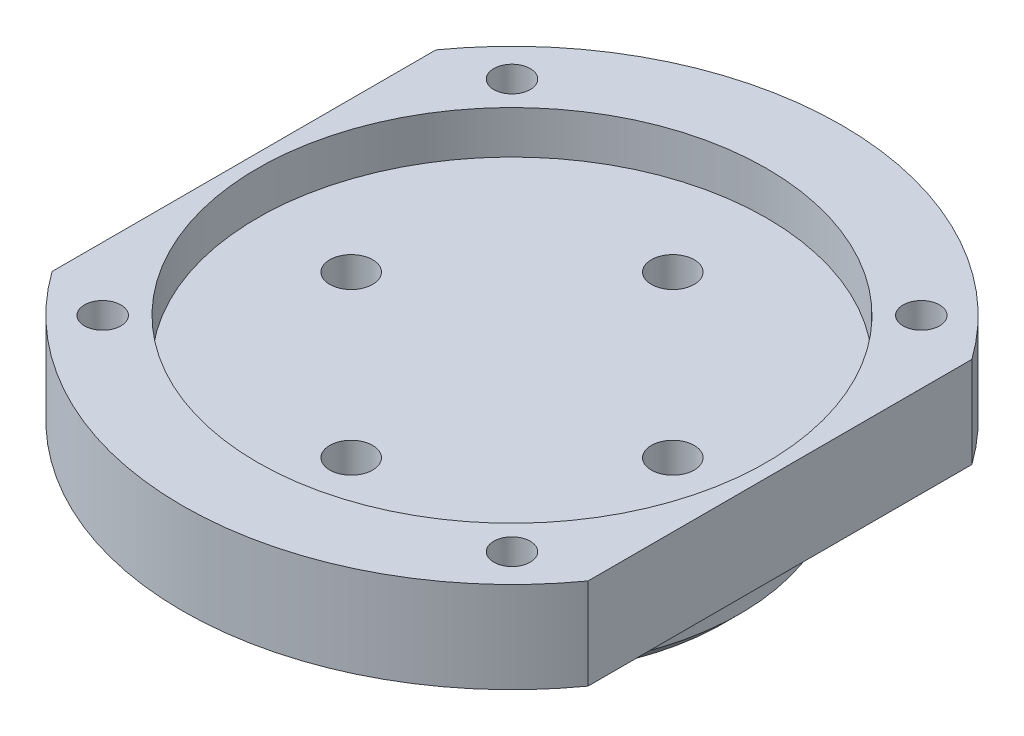
ISO-10303-21;
HEADER;
FILE_DESCRIPTION(('STEP AP214'),'2;1');
FILE_NAME('part.step','',(''),(''),'','','');
FILE_SCHEMA(('AUTOMOTIVE_DESIGN { 1 0 10303 214 1 1 1 1 }'));
ENDSEC;
DATA;
#1=APPLICATION_CONTEXT('core data for automotive mechanical design processes');
#2=APPLICATION_PROTOCOL_DEFINITION('international standard','automotive_design',2000,#1);
#3=PRODUCT_CONTEXT('',#1,'mechanical');
#4=PRODUCT('Part','Part','',(#3));
#5=PRODUCT_RELATED_PRODUCT_CATEGORY('part','',(#4));
#6=PRODUCT_DEFINITION_FORMATION('','',#4);
#7=PRODUCT_DEFINITION_CONTEXT('part definition',#1,'design');
#8=PRODUCT_DEFINITION('design','',#6,#7);
#9=PRODUCT_DEFINITION_SHAPE('','',#8);
#10=(LENGTH_UNIT() NAMED_UNIT(*) SI_UNIT(.MILLI.,.METRE.));
#11=(NAMED_UNIT(*) PLANE_ANGLE_UNIT() SI_UNIT($,.RADIAN.));
#12=(NAMED_UNIT(*) SI_UNIT($,.STERADIAN.) SOLID_ANGLE_UNIT());
#13=UNCERTAINTY_MEASURE_WITH_UNIT(LENGTH_MEASURE(1.E-05),#10,'distance_accuracy_value','');
#14=(GEOMETRIC_REPRESENTATION_CONTEXT(3) GLOBAL_UNCERTAINTY_ASSIGNED_CONTEXT((#13)) GLOBAL_UNIT_ASSIGNED_CONTEXT((#10,
#11,#12)) REPRESENTATION_CONTEXT('',''));
#15=CARTESIAN_POINT('',(0.,0.,0.));
#16=DIRECTION('',(0.,0.,1.));
#17=DIRECTION('',(1.,0.,0.));
#18=AXIS2_PLACEMENT_3D('',#15,#16,#17);
#19=CARTESIAN_POINT('',(0.,30.,30.));
#20=DIRECTION('',(0.,-1.,0.));
#21=DIRECTION('',(0.,0.,-1.));
#22=AXIS2_PLACEMENT_3D('',#19,#20,#21);
#23=CYLINDRICAL_SURFACE('',#22,4.);
#24=CARTESIAN_POINT('',(0.,22.,30.));
#25=DIRECTION('',(0.,1.,0.));
#26=DIRECTION('',(0.,0.,1.));
#27=AXIS2_PLACEMENT_3D('',#24,#25,#26);
#28=CIRCLE('',#27,4.);
#29=CARTESIAN_POINT('',(0.,22.,34.));
#30=VERTEX_POINT('',#29);
#31=EDGE_CURVE('E116',#30,#30,#28,.T.);
#32=ORIENTED_EDGE('',*,*,#31,.T.);
#33=EDGE_LOOP('',(#32));
#34=FACE_BOUND('',#33,.T.);
#35=CARTESIAN_POINT('',(0.,13.,30.));
#36=DIRECTION('',(0.,-1.,0.));
#37=DIRECTION('',(0.,0.,-1.));
#38=AXIS2_PLACEMENT_3D('',#35,#36,#37);
#39=CIRCLE('',#38,4.);
#40=CARTESIAN_POINT('',(0.,13.,26.));
#41=VERTEX_POINT('',#40);
#42=EDGE_CURVE('E120',#41,#41,#39,.F.);
#43=ORIENTED_EDGE('',*,*,#42,.F.);
#44=EDGE_LOOP('',(#43));
#45=FACE_BOUND('',#44,.T.);
#46=ADVANCED_FACE('F41',(#34,#45),#23,.F.);
#47=CARTESIAN_POINT('',(-30.,30.,0.));
#48=DIRECTION('',(0.,-1.,0.));
#49=DIRECTION('',(0.,0.,-1.));
#50=AXIS2_PLACEMENT_3D('',#47,#48,#49);
#51=CYLINDRICAL_SURFACE('',#50,4.00000000000001);
#52=CARTESIAN_POINT('',(-30.,22.,0.));
#53=DIRECTION('',(0.,1.,0.));
#54=DIRECTION('',(0.,0.,1.));
#55=AXIS2_PLACEMENT_3D('',#52,#53,#54);
#56=CIRCLE('',#55,4.00000000000001);
#57=CARTESIAN_POINT('',(-30.,22.,4.));
#58=VERTEX_POINT('',#57);
#59=EDGE_CURVE('E119',#58,#58,#56,.T.);
#60=ORIENTED_EDGE('',*,*,#59,.T.);
#61=EDGE_LOOP('',(#60));
#62=FACE_BOUND('',#61,.T.);
#63=CARTESIAN_POINT('',(-30.,13.,0.));
#64=DIRECTION('',(0.,-1.,0.));
#65=DIRECTION('',(0.,0.,-1.));
#66=AXIS2_PLACEMENT_3D('',#63,#64,#65);
#67=CIRCLE('',#66,4.00000000000001);
#68=CARTESIAN_POINT('',(-30.,13.,-4.00000000000001));
#69=VERTEX_POINT('',#68);
#70=EDGE_CURVE('E136',#69,#69,#67,.F.);
#71=ORIENTED_EDGE('',*,*,#70,.F.);
#72=EDGE_LOOP('',(#71));
#73=FACE_BOUND('',#72,.T.);
#74=ADVANCED_FACE('F226',(#62,#73),#51,.F.);
#75=CARTESIAN_POINT('',(0.,30.,-30.));
#76=DIRECTION('',(0.,-1.,0.));
#77=DIRECTION('',(0.,0.,-1.));
#78=AXIS2_PLACEMENT_3D('',#75,#76,#77);
#79=CYLINDRICAL_SURFACE('',#78,4.00000000000001);
#80=CARTESIAN_POINT('',(0.,22.,-30.));
#81=DIRECTION('',(0.,1.,0.));
#82=DIRECTION('',(0.,0.,1.));
#83=AXIS2_PLACEMENT_3D('',#80,#81,#82);
#84=CIRCLE('',#83,4.00000000000001);
#85=CARTESIAN_POINT('',(0.,22.,-26.));
#86=VERTEX_POINT('',#85);
#87=EDGE_CURVE('E123',#86,#86,#84,.T.);
#88=ORIENTED_EDGE('',*,*,#87,.T.);
#89=EDGE_LOOP('',(#88));
#90=FACE_BOUND('',#89,.T.);
#91=CARTESIAN_POINT('',(0.,13.,-30.));
#92=DIRECTION('',(0.,-1.,0.));
#93=DIRECTION('',(0.,0.,-1.));
#94=AXIS2_PLACEMENT_3D('',#91,#92,#93);
#95=CIRCLE('',#94,4.00000000000001);
#96=CARTESIAN_POINT('',(0.,13.,-34.));
#97=VERTEX_POINT('',#96);
#98=EDGE_CURVE('E132',#97,#97,#95,.F.);
#99=ORIENTED_EDGE('',*,*,#98,.F.);
#100=EDGE_LOOP('',(#99));
#101=FACE_BOUND('',#100,.T.);
#102=ADVANCED_FACE('F232',(#90,#101),#79,.F.);
#103=CARTESIAN_POINT('',(30.,30.,0.));
#104=DIRECTION('',(0.,-1.,0.));
#105=DIRECTION('',(0.,0.,-1.));
#106=AXIS2_PLACEMENT_3D('',#103,#104,#105);
#107=CYLINDRICAL_SURFACE('',#106,4.00000000000001);
#108=CARTESIAN_POINT('',(30.,22.,0.));
#109=DIRECTION('',(0.,1.,0.));
#110=DIRECTION('',(0.,0.,1.));
#111=AXIS2_PLACEMENT_3D('',#108,#109,#110);
#112=CIRCLE('',#111,4.00000000000001);
#113=CARTESIAN_POINT('',(30.,22.,4.00000000000001));
#114=VERTEX_POINT('',#113);
#115=EDGE_CURVE('E126',#114,#114,#112,.T.);
#116=ORIENTED_EDGE('',*,*,#115,.T.);
#117=EDGE_LOOP('',(#116));
#118=FACE_BOUND('',#117,.T.);
#119=CARTESIAN_POINT('',(30.,13.,0.));
#120=DIRECTION('',(0.,-1.,0.));
#121=DIRECTION('',(0.,0.,-1.));
#122=AXIS2_PLACEMENT_3D('',#119,#120,#121);
#123=CIRCLE('',#122,4.00000000000001);
#124=CARTESIAN_POINT('',(30.,13.,-4.00000000000001));
#125=VERTEX_POINT('',#124);
#126=EDGE_CURVE('E129',#125,#125,#123,.F.);
#127=ORIENTED_EDGE('',*,*,#126,.F.);
#128=EDGE_LOOP('',(#127));
#129=FACE_BOUND('',#128,.T.);
#130=ADVANCED_FACE('F282',(#118,#129),#107,.F.);
#131=CARTESIAN_POINT('',(0.,0.,0.));
#132=DIRECTION('',(0.,-1.,0.));
#133=DIRECTION('',(0.,0.,-1.));
#134=AXIS2_PLACEMENT_3D('',#131,#132,#133);
#135=CYLINDRICAL_SURFACE('',#134,61.5);
#136=CARTESIAN_POINT('',(0.,13.,0.));
#137=DIRECTION('',(0.,-1.,0.));
#138=DIRECTION('',(0.,0.,-1.));
#139=AXIS2_PLACEMENT_3D('',#136,#137,#138);
#140=CIRCLE('',#139,61.5);
#141=CARTESIAN_POINT('',(50.,13.,35.8085185395878));
#142=VERTEX_POINT('',#141);
#143=CARTESIAN_POINT('',(-50.,13.,35.8085185395877));
#144=VERTEX_POINT('',#143);
#145=EDGE_CURVE('E100',#142,#144,#140,.T.);
#146=ORIENTED_EDGE('',*,*,#145,.F.);
#147=DIRECTION('',(0.,-1.,0.));
#148=VECTOR('',#147,1.);
#149=CARTESIAN_POINT('',(50.,0.,35.8085185395878));
#150=LINE('',#149,#148);
#151=CARTESIAN_POINT('',(50.,30.,35.8085185395878));
#152=VERTEX_POINT('',#151);
#153=EDGE_CURVE('E85',#152,#142,#150,.T.);
#154=ORIENTED_EDGE('',*,*,#153,.F.);
#155=CARTESIAN_POINT('',(0.,30.,0.));
#156=DIRECTION('',(0.,-1.,0.));
#157=DIRECTION('',(0.,0.,-1.));
#158=AXIS2_PLACEMENT_3D('',#155,#156,#157);
#159=CIRCLE('',#158,61.5);
#160=CARTESIAN_POINT('',(-50.,30.,35.8085185395877));
#161=VERTEX_POINT('',#160);
#162=EDGE_CURVE('E98',#152,#161,#159,.T.);
#163=ORIENTED_EDGE('',*,*,#162,.T.);
#164=DIRECTION('',(0.,-1.,0.));
#165=VECTOR('',#164,1.);
#166=CARTESIAN_POINT('',(-50.,0.,35.8085185395877));
#167=LINE('',#166,#165);
#168=EDGE_CURVE('E59',#144,#161,#167,.F.);
#169=ORIENTED_EDGE('',*,*,#168,.F.);
#170=EDGE_LOOP('',(#146,#154,#163,#169));
#171=FACE_BOUND('',#170,.T.);
#172=ADVANCED_FACE('F97',(#171),#135,.T.);
#173=CARTESIAN_POINT('',(0.,0.,0.));
#174=DIRECTION('',(0.,-1.,0.));
#175=DIRECTION('',(0.,0.,-1.));
#176=AXIS2_PLACEMENT_3D('',#173,#174,#175);
#177=PLANE('',#176);
#178=CARTESIAN_POINT('',(0.,0.,0.));
#179=DIRECTION('',(0.,-1.,0.));
#180=DIRECTION('',(0.,0.,-1.));
#181=AXIS2_PLACEMENT_3D('',#178,#179,#180);
#182=CIRCLE('',#181,39.5);
#183=CARTESIAN_POINT('',(0.,0.,-39.5));
#184=VERTEX_POINT('',#183);
#185=EDGE_CURVE('E51',#184,#184,#182,.T.);
#186=ORIENTED_EDGE('',*,*,#185,.T.);
#187=EDGE_LOOP('',(#186));
#188=FACE_BOUND('',#187,.T.);
#189=CARTESIAN_POINT('',(30.,0.,0.));
#190=DIRECTION('',(0.,-1.,0.));
#191=DIRECTION('',(0.,0.,-1.));
#192=AXIS2_PLACEMENT_3D('',#189,#190,#191);
#193=CIRCLE('',#192,8.);
#194=CARTESIAN_POINT('',(30.,0.,-8.));
#195=VERTEX_POINT('',#194);
#196=EDGE_CURVE('E177',#195,#195,#193,.T.);
#197=ORIENTED_EDGE('',*,*,#196,.F.);
#198=EDGE_LOOP('',(#197));
#199=FACE_BOUND('',#198,.T.);
#200=CARTESIAN_POINT('',(-30.,0.,0.));
#201=DIRECTION('',(0.,-1.,0.));
#202=DIRECTION('',(0.,0.,-1.));
#203=AXIS2_PLACEMENT_3D('',#200,#201,#202);
#204=CIRCLE('',#203,8.);
#205=CARTESIAN_POINT('',(-30.,0.,-8.00000000000001));
#206=VERTEX_POINT('',#205);
#207=EDGE_CURVE('E183',#206,#206,#204,.T.);
#208=ORIENTED_EDGE('',*,*,#207,.F.);
#209=EDGE_LOOP('',(#208));
#210=FACE_BOUND('',#209,.T.);
#211=CARTESIAN_POINT('',(0.,0.,-30.));
#212=DIRECTION('',(0.,-1.,0.));
#213=DIRECTION('',(0.,0.,-1.));
#214=AXIS2_PLACEMENT_3D('',#211,#212,#213);
#215=CIRCLE('',#214,8.);
#216=CARTESIAN_POINT('',(0.,0.,-38.));
#217=VERTEX_POINT('',#216);
#218=EDGE_CURVE('E189',#217,#217,#215,.T.);
#219=ORIENTED_EDGE('',*,*,#218,.F.);
#220=EDGE_LOOP('',(#219));
#221=FACE_BOUND('',#220,.T.);
#222=CARTESIAN_POINT('',(0.,0.,30.));
#223=DIRECTION('',(0.,-1.,0.));
#224=DIRECTION('',(0.,0.,-1.));
#225=AXIS2_PLACEMENT_3D('',#222,#223,#224);
#226=CIRCLE('',#225,8.);
#227=CARTESIAN_POINT('',(0.,0.,22.));
#228=VERTEX_POINT('',#227);
#229=EDGE_CURVE('E146',#228,#228,#226,.T.);
#230=ORIENTED_EDGE('',*,*,#229,.F.);
#231=EDGE_LOOP('',(#230));
#232=FACE_BOUND('',#231,.T.);
#233=ADVANCED_FACE('F314',(#188,#199,#210,#221,#232),#177,.T.);
#234=CARTESIAN_POINT('',(0.,0.,0.));
#235=DIRECTION('',(0.,-1.,0.));
#236=DIRECTION('',(0.,0.,-1.));
#237=AXIS2_PLACEMENT_3D('',#234,#235,#236);
#238=CYLINDRICAL_SURFACE('',#237,42.5);
#239=CARTESIAN_POINT('',(0.,3.00000000000004,0.));
#240=DIRECTION('',(0.,-1.,0.));
#241=DIRECTION('',(0.,0.,-1.));
#242=AXIS2_PLACEMENT_3D('',#239,#240,#241);
#243=CIRCLE('',#242,42.5);
#244=CARTESIAN_POINT('',(0.,3.00000000000004,-42.5));
#245=VERTEX_POINT('',#244);
#246=EDGE_CURVE('E11',#245,#245,#243,.F.);
#247=ORIENTED_EDGE('',*,*,#246,.T.);
#248=EDGE_LOOP('',(#247));
#249=FACE_BOUND('',#248,.T.);
#250=CARTESIAN_POINT('',(0.,13.,0.));
#251=DIRECTION('',(0.,-1.,0.));
#252=DIRECTION('',(0.,0.,-1.));
#253=AXIS2_PLACEMENT_3D('',#250,#251,#252);
#254=CIRCLE('',#253,42.5);
#255=CARTESIAN_POINT('',(0.,13.,-42.5));
#256=VERTEX_POINT('',#255);
#257=EDGE_CURVE('E113',#256,#256,#254,.T.);
#258=ORIENTED_EDGE('',*,*,#257,.T.);
#259=EDGE_LOOP('',(#258));
#260=FACE_BOUND('',#259,.T.);
#261=ADVANCED_FACE('F322',(#249,#260),#238,.T.);
#262=CARTESIAN_POINT('',(42.5,13.,0.));
#263=DIRECTION('',(0.,-1.,0.));
#264=DIRECTION('',(0.,0.,-1.));
#265=AXIS2_PLACEMENT_3D('',#262,#263,#264);
#266=PLANE('',#265);
#267=CARTESIAN_POINT('',(38.1837661840736,13.,-38.1837661840736));
#268=DIRECTION('',(0.,-1.,0.));
#269=DIRECTION('',(0.,0.,-1.));
#270=AXIS2_PLACEMENT_3D('',#267,#268,#269);
#271=CIRCLE('',#270,4.025);
#272=CARTESIAN_POINT('',(38.1837661840736,13.,-42.2087661840736));
#273=VERTEX_POINT('',#272);
#274=EDGE_CURVE('E579',#273,#273,#271,.T.);
#275=ORIENTED_EDGE('',*,*,#274,.F.);
#276=EDGE_LOOP('',(#275));
#277=FACE_BOUND('',#276,.T.);
#278=CARTESIAN_POINT('',(-38.1837661840736,13.,-38.1837661840736));
#279=DIRECTION('',(0.,-1.,0.));
#280=DIRECTION('',(0.,0.,-1.));
#281=AXIS2_PLACEMENT_3D('',#278,#279,#280);
#282=CIRCLE('',#281,4.025);
#283=CARTESIAN_POINT('',(-38.1837661840736,13.,-42.2087661840736));
#284=VERTEX_POINT('',#283);
#285=EDGE_CURVE('E161',#284,#284,#282,.T.);
#286=ORIENTED_EDGE('',*,*,#285,.F.);
#287=EDGE_LOOP('',(#286));
#288=FACE_BOUND('',#287,.T.);
#289=CARTESIAN_POINT('',(-38.1837661840735,13.,38.1837661840736));
#290=DIRECTION('',(0.,-1.,0.));
#291=DIRECTION('',(0.,0.,-1.));
#292=AXIS2_PLACEMENT_3D('',#289,#290,#291);
#293=CIRCLE('',#292,4.025);
#294=CARTESIAN_POINT('',(-38.1837661840735,13.,34.1587661840736));
#295=VERTEX_POINT('',#294);
#296=EDGE_CURVE('E154',#295,#295,#293,.T.);
#297=ORIENTED_EDGE('',*,*,#296,.F.);
#298=EDGE_LOOP('',(#297));
#299=FACE_BOUND('',#298,.T.);
#300=CARTESIAN_POINT('',(38.1837661840736,13.,38.1837661840735));
#301=DIRECTION('',(0.,-1.,0.));
#302=DIRECTION('',(0.,0.,-1.));
#303=AXIS2_PLACEMENT_3D('',#300,#301,#302);
#304=CIRCLE('',#303,4.025);
#305=CARTESIAN_POINT('',(38.1837661840736,13.,34.1587661840735));
#306=VERTEX_POINT('',#305);
#307=EDGE_CURVE('E150',#306,#306,#304,.T.);
#308=ORIENTED_EDGE('',*,*,#307,.F.);
#309=EDGE_LOOP('',(#308));
#310=FACE_BOUND('',#309,.T.);
#311=CARTESIAN_POINT('',(-50.,13.,-35.8085185395877));
#312=VERTEX_POINT('',#311);
#313=CARTESIAN_POINT('',(50.,13.,-35.8085185395878));
#314=VERTEX_POINT('',#313);
#315=EDGE_CURVE('E104',#312,#314,#140,.T.);
#316=ORIENTED_EDGE('',*,*,#315,.T.);
#317=DIRECTION('',(0.,0.,-1.));
#318=VECTOR('',#317,1.);
#319=CARTESIAN_POINT('',(50.,13.,61.5));
#320=LINE('',#319,#318);
#321=EDGE_CURVE('E92',#142,#314,#320,.T.);
#322=ORIENTED_EDGE('',*,*,#321,.F.);
#323=ORIENTED_EDGE('',*,*,#145,.T.);
#324=DIRECTION('',(0.,0.,1.));
#325=VECTOR('',#324,1.);
#326=CARTESIAN_POINT('',(-50.,13.,61.5));
#327=LINE('',#326,#325);
#328=EDGE_CURVE('E101',#312,#144,#327,.T.);
#329=ORIENTED_EDGE('',*,*,#328,.F.);
#330=EDGE_LOOP('',(#316,#322,#323,#329));
#331=FACE_BOUND('',#330,.T.);
#332=ORIENTED_EDGE('',*,*,#257,.F.);
#333=EDGE_LOOP('',(#332));
#334=FACE_BOUND('',#333,.T.);
#335=ADVANCED_FACE('F330',(#277,#288,#299,#310,#331,#334),#266,.T.);
#336=CARTESIAN_POINT('',(-50.,30.,-35.8085185395877));
#337=VERTEX_POINT('',#336);
#338=CARTESIAN_POINT('',(50.,30.,-35.8085185395878));
#339=VERTEX_POINT('',#338);
#340=EDGE_CURVE('E105',#337,#339,#159,.T.);
#341=ORIENTED_EDGE('',*,*,#340,.T.);
#342=DIRECTION('',(0.,-1.,0.));
#343=VECTOR('',#342,1.);
#344=CARTESIAN_POINT('',(50.,0.,-35.8085185395878));
#345=LINE('',#344,#343);
#346=EDGE_CURVE('E67',#314,#339,#345,.F.);
#347=ORIENTED_EDGE('',*,*,#346,.F.);
#348=ORIENTED_EDGE('',*,*,#315,.F.);
#349=DIRECTION('',(0.,-1.,0.));
#350=VECTOR('',#349,1.);
#351=CARTESIAN_POINT('',(-50.,0.,-35.8085185395877));
#352=LINE('',#351,#350);
#353=EDGE_CURVE('E198',#337,#312,#352,.T.);
#354=ORIENTED_EDGE('',*,*,#353,.F.);
#355=EDGE_LOOP('',(#341,#347,#348,#354));
#356=FACE_BOUND('',#355,.T.);
#357=ADVANCED_FACE('F222',(#356),#135,.T.);
#358=CARTESIAN_POINT('',(61.5,30.,0.));
#359=DIRECTION('',(0.,1.,0.));
#360=DIRECTION('',(0.,0.,1.));
#361=AXIS2_PLACEMENT_3D('',#358,#359,#360);
#362=PLANE('',#361);
#363=CARTESIAN_POINT('',(38.1837661840736,30.,-38.1837661840736));
#364=DIRECTION('',(0.,1.,0.));
#365=DIRECTION('',(0.,0.,1.));
#366=AXIS2_PLACEMENT_3D('',#363,#364,#365);
#367=CIRCLE('',#366,3.39999999999999);
#368=CARTESIAN_POINT('',(38.1837661840736,30.,-34.7837661840736));
#369=VERTEX_POINT('',#368);
#370=EDGE_CURVE('E46',#369,#369,#367,.T.);
#371=ORIENTED_EDGE('',*,*,#370,.F.);
#372=EDGE_LOOP('',(#371));
#373=FACE_BOUND('',#372,.T.);
#374=CARTESIAN_POINT('',(-38.1837661840736,30.,-38.1837661840736));
#375=DIRECTION('',(0.,1.,0.));
#376=DIRECTION('',(0.,0.,1.));
#377=AXIS2_PLACEMENT_3D('',#374,#375,#376);
#378=CIRCLE('',#377,3.39999999999999);
#379=CARTESIAN_POINT('',(-38.1837661840736,30.,-34.7837661840736));
#380=VERTEX_POINT('',#379);
#381=EDGE_CURVE('E152',#380,#380,#378,.T.);
#382=ORIENTED_EDGE('',*,*,#381,.F.);
#383=EDGE_LOOP('',(#382));
#384=FACE_BOUND('',#383,.T.);
#385=CARTESIAN_POINT('',(-38.1837661840735,30.,38.1837661840736));
#386=DIRECTION('',(0.,1.,0.));
#387=DIRECTION('',(0.,0.,1.));
#388=AXIS2_PLACEMENT_3D('',#385,#386,#387);
#389=CIRCLE('',#388,3.39999999999999);
#390=CARTESIAN_POINT('',(-38.1837661840735,30.,41.5837661840736));
#391=VERTEX_POINT('',#390);
#392=EDGE_CURVE('E148',#391,#391,#389,.T.);
#393=ORIENTED_EDGE('',*,*,#392,.F.);
#394=EDGE_LOOP('',(#393));
#395=FACE_BOUND('',#394,.T.);
#396=CARTESIAN_POINT('',(38.1837661840736,30.,38.1837661840735));
#397=DIRECTION('',(0.,1.,0.));
#398=DIRECTION('',(0.,0.,1.));
#399=AXIS2_PLACEMENT_3D('',#396,#397,#398);
#400=CIRCLE('',#399,3.39999999999999);
#401=CARTESIAN_POINT('',(38.1837661840736,30.,41.5837661840735));
#402=VERTEX_POINT('',#401);
#403=EDGE_CURVE('E143',#402,#402,#400,.T.);
#404=ORIENTED_EDGE('',*,*,#403,.F.);
#405=EDGE_LOOP('',(#404));
#406=FACE_BOUND('',#405,.T.);
#407=CARTESIAN_POINT('',(0.,30.,0.));
#408=DIRECTION('',(0.,-1.,0.));
#409=DIRECTION('',(0.,0.,-1.));
#410=AXIS2_PLACEMENT_3D('',#407,#408,#409);
#411=CIRCLE('',#410,47.5);
#412=CARTESIAN_POINT('',(0.,30.,-47.5));
#413=VERTEX_POINT('',#412);
#414=EDGE_CURVE('E109',#413,#413,#411,.T.);
#415=ORIENTED_EDGE('',*,*,#414,.T.);
#416=EDGE_LOOP('',(#415));
#417=FACE_BOUND('',#416,.T.);
#418=ORIENTED_EDGE('',*,*,#162,.F.);
#419=DIRECTION('',(0.,0.,-1.));
#420=VECTOR('',#419,1.);
#421=CARTESIAN_POINT('',(50.,30.,61.5));
#422=LINE('',#421,#420);
#423=EDGE_CURVE('E82',#152,#339,#422,.T.);
#424=ORIENTED_EDGE('',*,*,#423,.T.);
#425=ORIENTED_EDGE('',*,*,#340,.F.);
#426=DIRECTION('',(0.,0.,1.));
#427=VECTOR('',#426,1.);
#428=CARTESIAN_POINT('',(-50.,30.,61.5));
#429=LINE('',#428,#427);
#430=EDGE_CURVE('E91',#337,#161,#429,.T.);
#431=ORIENTED_EDGE('',*,*,#430,.T.);
#432=EDGE_LOOP('',(#418,#424,#425,#431));
#433=FACE_BOUND('',#432,.T.);
#434=ADVANCED_FACE('F103',(#373,#384,#395,#406,#417,#433),#362,.T.);
#435=CARTESIAN_POINT('',(0.,0.,0.));
#436=DIRECTION('',(0.,-1.,0.));
#437=DIRECTION('',(0.,0.,-1.));
#438=AXIS2_PLACEMENT_3D('',#435,#436,#437);
#439=CYLINDRICAL_SURFACE('',#438,47.5);
#440=CARTESIAN_POINT('',(0.,22.,0.));
#441=DIRECTION('',(0.,-1.,0.));
#442=DIRECTION('',(0.,0.,-1.));
#443=AXIS2_PLACEMENT_3D('',#440,#441,#442);
#444=CIRCLE('',#443,47.5);
#445=CARTESIAN_POINT('',(0.,22.,-47.5));
#446=VERTEX_POINT('',#445);
#447=EDGE_CURVE('E203',#446,#446,#444,.T.);
#448=ORIENTED_EDGE('',*,*,#447,.T.);
#449=EDGE_LOOP('',(#448));
#450=FACE_BOUND('',#449,.T.);
#451=ORIENTED_EDGE('',*,*,#414,.F.);
#452=EDGE_LOOP('',(#451));
#453=FACE_BOUND('',#452,.T.);
#454=ADVANCED_FACE('F211',(#450,#453),#439,.F.);
#455=CARTESIAN_POINT('',(47.5,22.,0.));
#456=DIRECTION('',(0.,1.,0.));
#457=DIRECTION('',(0.,0.,1.));
#458=AXIS2_PLACEMENT_3D('',#455,#456,#457);
#459=PLANE('',#458);
#460=ORIENTED_EDGE('',*,*,#115,.F.);
#461=EDGE_LOOP('',(#460));
#462=FACE_BOUND('',#461,.T.);
#463=ORIENTED_EDGE('',*,*,#87,.F.);
#464=EDGE_LOOP('',(#463));
#465=FACE_BOUND('',#464,.T.);
#466=ORIENTED_EDGE('',*,*,#59,.F.);
#467=EDGE_LOOP('',(#466));
#468=FACE_BOUND('',#467,.T.);
#469=ORIENTED_EDGE('',*,*,#31,.F.);
#470=EDGE_LOOP('',(#469));
#471=FACE_BOUND('',#470,.T.);
#472=ORIENTED_EDGE('',*,*,#447,.F.);
#473=EDGE_LOOP('',(#472));
#474=FACE_BOUND('',#473,.T.);
#475=ADVANCED_FACE('F213',(#462,#465,#468,#471,#474),#459,.T.);
#476=CARTESIAN_POINT('',(-50.,-0.001000000000001,61.5));
#477=DIRECTION('',(-1.,0.,0.));
#478=DIRECTION('',(0.,0.,1.));
#479=AXIS2_PLACEMENT_3D('',#476,#477,#478);
#480=PLANE('',#479);
#481=ORIENTED_EDGE('',*,*,#430,.F.);
#482=ORIENTED_EDGE('',*,*,#353,.T.);
#483=ORIENTED_EDGE('',*,*,#328,.T.);
#484=ORIENTED_EDGE('',*,*,#168,.T.);
#485=EDGE_LOOP('',(#481,#482,#483,#484));
#486=FACE_BOUND('',#485,.T.);
#487=ADVANCED_FACE('F219',(#486),#480,.T.);
#488=CARTESIAN_POINT('',(50.,-0.001000000000001,61.5));
#489=DIRECTION('',(1.,0.,0.));
#490=DIRECTION('',(0.,0.,-1.));
#491=AXIS2_PLACEMENT_3D('',#488,#489,#490);
#492=PLANE('',#491);
#493=ORIENTED_EDGE('',*,*,#423,.F.);
#494=ORIENTED_EDGE('',*,*,#153,.T.);
#495=ORIENTED_EDGE('',*,*,#321,.T.);
#496=ORIENTED_EDGE('',*,*,#346,.T.);
#497=EDGE_LOOP('',(#493,#494,#495,#496));
#498=FACE_BOUND('',#497,.T.);
#499=ADVANCED_FACE('F84',(#498),#492,.T.);
#500=CARTESIAN_POINT('',(30.,13.,0.));
#501=DIRECTION('',(0.,-1.,0.));
#502=DIRECTION('',(0.,0.,-1.));
#503=AXIS2_PLACEMENT_3D('',#500,#501,#502);
#504=PLANE('',#503);
#505=CARTESIAN_POINT('',(30.,13.,0.));
#506=DIRECTION('',(0.,-1.,0.));
#507=DIRECTION('',(0.,0.,-1.));
#508=AXIS2_PLACEMENT_3D('',#505,#506,#507);
#509=CIRCLE('',#508,8.);
#510=CARTESIAN_POINT('',(30.,13.,-8.));
#511=VERTEX_POINT('',#510);
#512=EDGE_CURVE('E133',#511,#511,#509,.T.);
#513=ORIENTED_EDGE('',*,*,#512,.T.);
#514=EDGE_LOOP('',(#513));
#515=FACE_BOUND('',#514,.T.);
#516=ORIENTED_EDGE('',*,*,#126,.T.);
#517=EDGE_LOOP('',(#516));
#518=FACE_BOUND('',#517,.T.);
#519=ADVANCED_FACE('F241',(#515,#518),#504,.T.);
#520=CARTESIAN_POINT('',(30.,13.,0.));
#521=DIRECTION('',(0.,-1.,0.));
#522=DIRECTION('',(0.,0.,-1.));
#523=AXIS2_PLACEMENT_3D('',#520,#521,#522);
#524=CYLINDRICAL_SURFACE('',#523,8.);
#525=CARTESIAN_POINT('',(30.,13.,-8.));
#526=CARTESIAN_POINT('',(30.,12.8645833333333,-8.));
#527=CARTESIAN_POINT('',(30.,12.7291666666667,-8.));
#528=CARTESIAN_POINT('',(30.,12.4583333333333,-8.));
#529=CARTESIAN_POINT('',(30.,12.3229166666667,-8.));
#530=CARTESIAN_POINT('',(30.,12.0520833333333,-8.));
#531=CARTESIAN_POINT('',(30.,11.9166666666667,-8.));
#532=CARTESIAN_POINT('',(30.,11.6458333333333,-8.));
#533=CARTESIAN_POINT('',(30.,11.5104166666667,-8.));
#534=CARTESIAN_POINT('',(30.,11.2395833333333,-8.));
#535=CARTESIAN_POINT('',(30.,11.1041666666667,-8.));
#536=CARTESIAN_POINT('',(30.,10.8333333333333,-8.));
#537=CARTESIAN_POINT('',(30.,10.6979166666667,-8.));
#538=CARTESIAN_POINT('',(30.,10.4270833333333,-8.));
#539=CARTESIAN_POINT('',(30.,10.2916666666667,-8.));
#540=CARTESIAN_POINT('',(30.,10.0208333333333,-8.));
#541=CARTESIAN_POINT('',(30.,9.88541666666667,-8.));
#542=CARTESIAN_POINT('',(30.,9.61458333333333,-8.));
#543=CARTESIAN_POINT('',(30.,9.47916666666667,-8.));
#544=CARTESIAN_POINT('',(30.,9.20833333333333,-8.));
#545=CARTESIAN_POINT('',(30.,9.07291666666667,-8.));
#546=CARTESIAN_POINT('',(30.,8.80208333333333,-8.));
#547=CARTESIAN_POINT('',(30.,8.66666666666667,-8.));
#548=CARTESIAN_POINT('',(30.,8.39583333333333,-8.));
#549=CARTESIAN_POINT('',(30.,8.26041666666667,-8.));
#550=CARTESIAN_POINT('',(30.,7.98958333333333,-8.));
#551=CARTESIAN_POINT('',(30.,7.85416666666667,-8.));
#552=CARTESIAN_POINT('',(30.,7.58333333333333,-8.));
#553=CARTESIAN_POINT('',(30.,7.44791666666667,-8.));
#554=CARTESIAN_POINT('',(30.,7.17708333333333,-8.));
#555=CARTESIAN_POINT('',(30.,7.04166666666667,-8.));
#556=CARTESIAN_POINT('',(30.,6.77083333333333,-8.));
#557=CARTESIAN_POINT('',(30.,6.63541666666667,-8.));
#558=CARTESIAN_POINT('',(30.,6.36458333333333,-8.));
#559=CARTESIAN_POINT('',(30.,6.22916666666667,-8.));
#560=CARTESIAN_POINT('',(30.,5.95833333333333,-8.));
#561=CARTESIAN_POINT('',(30.,5.82291666666667,-8.));
#562=CARTESIAN_POINT('',(30.,5.55208333333333,-8.));
#563=CARTESIAN_POINT('',(30.,5.41666666666667,-8.));
#564=CARTESIAN_POINT('',(30.,5.14583333333333,-8.));
#565=CARTESIAN_POINT('',(30.,5.01041666666667,-8.));
#566=CARTESIAN_POINT('',(30.,4.73958333333333,-8.));
#567=CARTESIAN_POINT('',(30.,4.60416666666667,-8.));
#568=CARTESIAN_POINT('',(30.,4.33333333333333,-8.));
#569=CARTESIAN_POINT('',(30.,4.19791666666667,-8.));
#570=CARTESIAN_POINT('',(30.,3.92708333333333,-8.));
#571=CARTESIAN_POINT('',(30.,3.79166666666667,-8.));
#572=CARTESIAN_POINT('',(30.,3.52083333333333,-8.));
#573=CARTESIAN_POINT('',(30.,3.38541666666667,-8.));
#574=CARTESIAN_POINT('',(30.,3.11458333333333,-8.));
#575=CARTESIAN_POINT('',(30.,2.97916666666667,-8.));
#576=CARTESIAN_POINT('',(30.,2.70833333333333,-8.));
#577=CARTESIAN_POINT('',(30.,2.57291666666667,-8.));
#578=CARTESIAN_POINT('',(30.,2.30208333333333,-8.));
#579=CARTESIAN_POINT('',(30.,2.16666666666667,-8.));
#580=CARTESIAN_POINT('',(30.,1.89583333333333,-8.));
#581=CARTESIAN_POINT('',(30.,1.76041666666667,-8.));
#582=CARTESIAN_POINT('',(30.,1.48958333333333,-8.));
#583=CARTESIAN_POINT('',(30.,1.35416666666667,-8.));
#584=CARTESIAN_POINT('',(30.,1.08333333333333,-8.));
#585=CARTESIAN_POINT('',(30.,0.947916666666667,-8.));
#586=CARTESIAN_POINT('',(30.,0.677083333333334,-8.));
#587=CARTESIAN_POINT('',(30.,0.541666666666667,-8.));
#588=CARTESIAN_POINT('',(30.,0.270833333333334,-8.));
#589=CARTESIAN_POINT('',(30.,0.135416666666667,-8.));
#590=CARTESIAN_POINT('',(30.,0.,-8.));
#591=B_SPLINE_CURVE_WITH_KNOTS('',3,(#525,#526,#527,#528,#529,#530,#531,#532,#533,#534,#535,
#536,#537,#538,#539,#540,#541,#542,#543,#544,#545,#546,#547,#548,#549,#550,#551,#552,#553,#554,
#555,#556,#557,#558,#559,#560,#561,#562,#563,#564,#565,#566,#567,#568,#569,#570,#571,#572,#573,
#574,#575,#576,#577,#578,#579,#580,#581,#582,#583,#584,#585,#586,#587,#588,#589,#590),
.UNSPECIFIED.,.F.,.F.,(4,2,2,2,2,2,2,2,2,2,2,2,2,2,2,2,2,2,2,2,2,2,2,2,2,2,2,2,2,2,2,2,4),(0.,
0.406249999999999,0.812499999999999,1.21875,1.625,2.03125,2.4375,2.84375,3.25,3.65625,4.0625,
4.46875,4.875,5.28125,5.6875,6.09375,6.5,6.90625,7.3125,7.71875,8.125,8.53125,8.9375,9.34375,
9.75,10.15625,10.5625,10.96875,11.375,11.78125,12.1875,12.59375,13.),.UNSPECIFIED.);
#592=EDGE_CURVE('BSEAM245',#511,#195,#591,.T.);
#593=ORIENTED_EDGE('',*,*,#512,.F.);
#594=ORIENTED_EDGE('',*,*,#196,.T.);
#595=ORIENTED_EDGE('',*,*,#592,.T.);
#596=ORIENTED_EDGE('',*,*,#592,.F.);
#597=EDGE_LOOP('',(#593,#595,#594,#596));
#598=FACE_BOUND('',#597,.T.);
#599=ADVANCED_FACE('F245',(#598),#524,.F.);
#600=CARTESIAN_POINT('',(0.,13.,-30.));
#601=DIRECTION('',(0.,-1.,0.));
#602=DIRECTION('',(0.,0.,-1.));
#603=AXIS2_PLACEMENT_3D('',#600,#601,#602);
#604=PLANE('',#603);
#605=CARTESIAN_POINT('',(0.,13.,-30.));
#606=DIRECTION('',(0.,-1.,0.));
#607=DIRECTION('',(0.,0.,-1.));
#608=AXIS2_PLACEMENT_3D('',#605,#606,#607);
#609=CIRCLE('',#608,8.);
#610=CARTESIAN_POINT('',(0.,13.,-38.));
#611=VERTEX_POINT('',#610);
#612=EDGE_CURVE('E186',#611,#611,#609,.T.);
#613=ORIENTED_EDGE('',*,*,#612,.T.);
#614=EDGE_LOOP('',(#613));
#615=FACE_BOUND('',#614,.T.);
#616=ORIENTED_EDGE('',*,*,#98,.T.);
#617=EDGE_LOOP('',(#616));
#618=FACE_BOUND('',#617,.T.);
#619=ADVANCED_FACE('F251',(#615,#618),#604,.T.);
#620=CARTESIAN_POINT('',(0.,13.,-30.));
#621=DIRECTION('',(0.,-1.,0.));
#622=DIRECTION('',(0.,0.,-1.));
#623=AXIS2_PLACEMENT_3D('',#620,#621,#622);
#624=CYLINDRICAL_SURFACE('',#623,8.);
#625=CARTESIAN_POINT('',(0.,13.,-38.));
#626=CARTESIAN_POINT('',(0.,12.8645833333333,-38.));
#627=CARTESIAN_POINT('',(0.,12.7291666666667,-38.));
#628=CARTESIAN_POINT('',(0.,12.4583333333333,-38.));
#629=CARTESIAN_POINT('',(0.,12.3229166666667,-38.));
#630=CARTESIAN_POINT('',(0.,12.0520833333333,-38.));
#631=CARTESIAN_POINT('',(0.,11.9166666666667,-38.));
#632=CARTESIAN_POINT('',(0.,11.6458333333333,-38.));
#633=CARTESIAN_POINT('',(0.,11.5104166666667,-38.));
#634=CARTESIAN_POINT('',(0.,11.2395833333333,-38.));
#635=CARTESIAN_POINT('',(0.,11.1041666666667,-38.));
#636=CARTESIAN_POINT('',(0.,10.8333333333333,-38.));
#637=CARTESIAN_POINT('',(0.,10.6979166666667,-38.));
#638=CARTESIAN_POINT('',(0.,10.4270833333333,-38.));
#639=CARTESIAN_POINT('',(0.,10.2916666666667,-38.));
#640=CARTESIAN_POINT('',(0.,10.0208333333333,-38.));
#641=CARTESIAN_POINT('',(0.,9.88541666666667,-38.));
#642=CARTESIAN_POINT('',(0.,9.61458333333333,-38.));
#643=CARTESIAN_POINT('',(0.,9.47916666666667,-38.));
#644=CARTESIAN_POINT('',(0.,9.20833333333333,-38.));
#645=CARTESIAN_POINT('',(0.,9.07291666666667,-38.));
#646=CARTESIAN_POINT('',(0.,8.80208333333333,-38.));
#647=CARTESIAN_POINT('',(0.,8.66666666666667,-38.));
#648=CARTESIAN_POINT('',(0.,8.39583333333333,-38.));
#649=CARTESIAN_POINT('',(0.,8.26041666666667,-38.));
#650=CARTESIAN_POINT('',(0.,7.98958333333333,-38.));
#651=CARTESIAN_POINT('',(0.,7.85416666666667,-38.));
#652=CARTESIAN_POINT('',(0.,7.58333333333333,-38.));
#653=CARTESIAN_POINT('',(0.,7.44791666666667,-38.));
#654=CARTESIAN_POINT('',(0.,7.17708333333333,-38.));
#655=CARTESIAN_POINT('',(0.,7.04166666666667,-38.));
#656=CARTESIAN_POINT('',(0.,6.77083333333333,-38.));
#657=CARTESIAN_POINT('',(0.,6.63541666666667,-38.));
#658=CARTESIAN_POINT('',(0.,6.36458333333333,-38.));
#659=CARTESIAN_POINT('',(0.,6.22916666666667,-38.));
#660=CARTESIAN_POINT('',(0.,5.95833333333333,-38.));
#661=CARTESIAN_POINT('',(0.,5.82291666666667,-38.));
#662=CARTESIAN_POINT('',(0.,5.55208333333333,-38.));
#663=CARTESIAN_POINT('',(0.,5.41666666666667,-38.));
#664=CARTESIAN_POINT('',(0.,5.14583333333333,-38.));
#665=CARTESIAN_POINT('',(0.,5.01041666666667,-38.));
#666=CARTESIAN_POINT('',(0.,4.73958333333333,-38.));
#667=CARTESIAN_POINT('',(0.,4.60416666666667,-38.));
#668=CARTESIAN_POINT('',(0.,4.33333333333333,-38.));
#669=CARTESIAN_POINT('',(0.,4.19791666666667,-38.));
#670=CARTESIAN_POINT('',(0.,3.92708333333333,-38.));
#671=CARTESIAN_POINT('',(0.,3.79166666666667,-38.));
#672=CARTESIAN_POINT('',(0.,3.52083333333333,-38.));
#673=CARTESIAN_POINT('',(0.,3.38541666666667,-38.));
#674=CARTESIAN_POINT('',(0.,3.11458333333333,-38.));
#675=CARTESIAN_POINT('',(0.,2.97916666666667,-38.));
#676=CARTESIAN_POINT('',(0.,2.70833333333333,-38.));
#677=CARTESIAN_POINT('',(0.,2.57291666666667,-38.));
#678=CARTESIAN_POINT('',(0.,2.30208333333333,-38.));
#679=CARTESIAN_POINT('',(0.,2.16666666666667,-38.));
#680=CARTESIAN_POINT('',(0.,1.89583333333333,-38.));
#681=CARTESIAN_POINT('',(0.,1.76041666666667,-38.));
#682=CARTESIAN_POINT('',(0.,1.48958333333333,-38.));
#683=CARTESIAN_POINT('',(0.,1.35416666666667,-38.));
#684=CARTESIAN_POINT('',(0.,1.08333333333333,-38.));
#685=CARTESIAN_POINT('',(0.,0.947916666666667,-38.));
#686=CARTESIAN_POINT('',(0.,0.677083333333334,-38.));
#687=CARTESIAN_POINT('',(0.,0.541666666666667,-38.));
#688=CARTESIAN_POINT('',(0.,0.270833333333334,-38.));
#689=CARTESIAN_POINT('',(0.,0.135416666666667,-38.));
#690=CARTESIAN_POINT('',(0.,0.,-38.));
#691=B_SPLINE_CURVE_WITH_KNOTS('',3,(#625,#626,#627,#628,#629,#630,#631,#632,#633,#634,#635,
#636,#637,#638,#639,#640,#641,#642,#643,#644,#645,#646,#647,#648,#649,#650,#651,#652,#653,#654,
#655,#656,#657,#658,#659,#660,#661,#662,#663,#664,#665,#666,#667,#668,#669,#670,#671,#672,#673,
#674,#675,#676,#677,#678,#679,#680,#681,#682,#683,#684,#685,#686,#687,#688,#689,#690),
.UNSPECIFIED.,.F.,.F.,(4,2,2,2,2,2,2,2,2,2,2,2,2,2,2,2,2,2,2,2,2,2,2,2,2,2,2,2,2,2,2,2,4),(0.,
0.406249999999999,0.812499999999999,1.21875,1.625,2.03125,2.4375,2.84375,3.25,3.65625,4.0625,
4.46875,4.875,5.28125,5.6875,6.09375,6.5,6.90625,7.3125,7.71875,8.125,8.53125,8.9375,9.34375,
9.75,10.15625,10.5625,10.96875,11.375,11.78125,12.1875,12.59375,13.),.UNSPECIFIED.);
#692=EDGE_CURVE('BSEAM263',#611,#217,#691,.T.);
#693=ORIENTED_EDGE('',*,*,#612,.F.);
#694=ORIENTED_EDGE('',*,*,#218,.T.);
#695=ORIENTED_EDGE('',*,*,#692,.T.);
#696=ORIENTED_EDGE('',*,*,#692,.F.);
#697=EDGE_LOOP('',(#693,#695,#694,#696));
#698=FACE_BOUND('',#697,.T.);
#699=ADVANCED_FACE('F263',(#698),#624,.F.);
#700=CARTESIAN_POINT('',(-30.,13.,0.));
#701=DIRECTION('',(0.,-1.,0.));
#702=DIRECTION('',(0.,0.,-1.));
#703=AXIS2_PLACEMENT_3D('',#700,#701,#702);
#704=PLANE('',#703);
#705=CARTESIAN_POINT('',(-30.,13.,0.));
#706=DIRECTION('',(0.,-1.,0.));
#707=DIRECTION('',(0.,0.,-1.));
#708=AXIS2_PLACEMENT_3D('',#705,#706,#707);
#709=CIRCLE('',#708,8.);
#710=CARTESIAN_POINT('',(-30.,13.,-8.00000000000001));
#711=VERTEX_POINT('',#710);
#712=EDGE_CURVE('E180',#711,#711,#709,.T.);
#713=ORIENTED_EDGE('',*,*,#712,.T.);
#714=EDGE_LOOP('',(#713));
#715=FACE_BOUND('',#714,.T.);
#716=ORIENTED_EDGE('',*,*,#70,.T.);
#717=EDGE_LOOP('',(#716));
#718=FACE_BOUND('',#717,.T.);
#719=ADVANCED_FACE('F259',(#715,#718),#704,.T.);
#720=CARTESIAN_POINT('',(-30.,13.,0.));
#721=DIRECTION('',(0.,-1.,0.));
#722=DIRECTION('',(0.,0.,-1.));
#723=AXIS2_PLACEMENT_3D('',#720,#721,#722);
#724=CYLINDRICAL_SURFACE('',#723,8.);
#725=CARTESIAN_POINT('',(-30.,13.,-8.00000000000001));
#726=CARTESIAN_POINT('',(-30.,12.8645833333333,-8.00000000000001));
#727=CARTESIAN_POINT('',(-30.,12.7291666666667,-8.00000000000001));
#728=CARTESIAN_POINT('',(-30.,12.4583333333333,-8.00000000000001));
#729=CARTESIAN_POINT('',(-30.,12.3229166666667,-8.00000000000001));
#730=CARTESIAN_POINT('',(-30.,12.0520833333333,-8.00000000000001));
#731=CARTESIAN_POINT('',(-30.,11.9166666666667,-8.00000000000001));
#732=CARTESIAN_POINT('',(-30.,11.6458333333333,-8.00000000000001));
#733=CARTESIAN_POINT('',(-30.,11.5104166666667,-8.00000000000001));
#734=CARTESIAN_POINT('',(-30.,11.2395833333333,-8.00000000000001));
#735=CARTESIAN_POINT('',(-30.,11.1041666666667,-8.00000000000001));
#736=CARTESIAN_POINT('',(-30.,10.8333333333333,-8.00000000000001));
#737=CARTESIAN_POINT('',(-30.,10.6979166666667,-8.00000000000001));
#738=CARTESIAN_POINT('',(-30.,10.4270833333333,-8.00000000000001));
#739=CARTESIAN_POINT('',(-30.,10.2916666666667,-8.00000000000001));
#740=CARTESIAN_POINT('',(-30.,10.0208333333333,-8.00000000000001));
#741=CARTESIAN_POINT('',(-30.,9.88541666666667,-8.00000000000001));
#742=CARTESIAN_POINT('',(-30.,9.61458333333333,-8.00000000000001));
#743=CARTESIAN_POINT('',(-30.,9.47916666666667,-8.00000000000001));
#744=CARTESIAN_POINT('',(-30.,9.20833333333333,-8.00000000000001));
#745=CARTESIAN_POINT('',(-30.,9.07291666666667,-8.00000000000001));
#746=CARTESIAN_POINT('',(-30.,8.80208333333333,-8.00000000000001));
#747=CARTESIAN_POINT('',(-30.,8.66666666666667,-8.00000000000001));
#748=CARTESIAN_POINT('',(-30.,8.39583333333333,-8.00000000000001));
#749=CARTESIAN_POINT('',(-30.,8.26041666666667,-8.00000000000001));
#750=CARTESIAN_POINT('',(-30.,7.98958333333333,-8.00000000000001));
#751=CARTESIAN_POINT('',(-30.,7.85416666666667,-8.00000000000001));
#752=CARTESIAN_POINT('',(-30.,7.58333333333333,-8.00000000000001));
#753=CARTESIAN_POINT('',(-30.,7.44791666666667,-8.00000000000001));
#754=CARTESIAN_POINT('',(-30.,7.17708333333333,-8.00000000000001));
#755=CARTESIAN_POINT('',(-30.,7.04166666666667,-8.00000000000001));
#756=CARTESIAN_POINT('',(-30.,6.77083333333333,-8.00000000000001));
#757=CARTESIAN_POINT('',(-30.,6.63541666666667,-8.00000000000001));
#758=CARTESIAN_POINT('',(-30.,6.36458333333333,-8.00000000000001));
#759=CARTESIAN_POINT('',(-30.,6.22916666666667,-8.00000000000001));
#760=CARTESIAN_POINT('',(-30.,5.95833333333333,-8.00000000000001));
#761=CARTESIAN_POINT('',(-30.,5.82291666666667,-8.00000000000001));
#762=CARTESIAN_POINT('',(-30.,5.55208333333333,-8.00000000000001));
#763=CARTESIAN_POINT('',(-30.,5.41666666666667,-8.00000000000001));
#764=CARTESIAN_POINT('',(-30.,5.14583333333333,-8.00000000000001));
#765=CARTESIAN_POINT('',(-30.,5.01041666666667,-8.00000000000001));
#766=CARTESIAN_POINT('',(-30.,4.73958333333333,-8.00000000000001));
#767=CARTESIAN_POINT('',(-30.,4.60416666666667,-8.00000000000001));
#768=CARTESIAN_POINT('',(-30.,4.33333333333333,-8.00000000000001));
#769=CARTESIAN_POINT('',(-30.,4.19791666666667,-8.00000000000001));
#770=CARTESIAN_POINT('',(-30.,3.92708333333333,-8.00000000000001));
#771=CARTESIAN_POINT('',(-30.,3.79166666666667,-8.00000000000001));
#772=CARTESIAN_POINT('',(-30.,3.52083333333333,-8.00000000000001));
#773=CARTESIAN_POINT('',(-30.,3.38541666666667,-8.00000000000001));
#774=CARTESIAN_POINT('',(-30.,3.11458333333333,-8.00000000000001));
#775=CARTESIAN_POINT('',(-30.,2.97916666666667,-8.00000000000001));
#776=CARTESIAN_POINT('',(-30.,2.70833333333333,-8.00000000000001));
#777=CARTESIAN_POINT('',(-30.,2.57291666666667,-8.00000000000001));
#778=CARTESIAN_POINT('',(-30.,2.30208333333333,-8.00000000000001));
#779=CARTESIAN_POINT('',(-30.,2.16666666666667,-8.00000000000001));
#780=CARTESIAN_POINT('',(-30.,1.89583333333333,-8.00000000000001));
#781=CARTESIAN_POINT('',(-30.,1.76041666666667,-8.00000000000001));
#782=CARTESIAN_POINT('',(-30.,1.48958333333333,-8.00000000000001));
#783=CARTESIAN_POINT('',(-30.,1.35416666666667,-8.00000000000001));
#784=CARTESIAN_POINT('',(-30.,1.08333333333333,-8.00000000000001));
#785=CARTESIAN_POINT('',(-30.,0.947916666666667,-8.00000000000001));
#786=CARTESIAN_POINT('',(-30.,0.677083333333334,-8.00000000000001));
#787=CARTESIAN_POINT('',(-30.,0.541666666666667,-8.00000000000001));
#788=CARTESIAN_POINT('',(-30.,0.270833333333334,-8.00000000000001));
#789=CARTESIAN_POINT('',(-30.,0.135416666666667,-8.00000000000001));
#790=CARTESIAN_POINT('',(-30.,0.,-8.00000000000001));
#791=B_SPLINE_CURVE_WITH_KNOTS('',3,(#725,#726,#727,#728,#729,#730,#731,#732,#733,#734,#735,
#736,#737,#738,#739,#740,#741,#742,#743,#744,#745,#746,#747,#748,#749,#750,#751,#752,#753,#754,
#755,#756,#757,#758,#759,#760,#761,#762,#763,#764,#765,#766,#767,#768,#769,#770,#771,#772,#773,
#774,#775,#776,#777,#778,#779,#780,#781,#782,#783,#784,#785,#786,#787,#788,#789,#790),
.UNSPECIFIED.,.F.,.F.,(4,2,2,2,2,2,2,2,2,2,2,2,2,2,2,2,2,2,2,2,2,2,2,2,2,2,2,2,2,2,2,2,4),(0.,
0.406249999999999,0.812499999999999,1.21875,1.625,2.03125,2.4375,2.84375,3.25,3.65625,4.0625,
4.46875,4.875,5.28125,5.6875,6.09375,6.5,6.90625,7.3125,7.71875,8.125,8.53125,8.9375,9.34375,
9.75,10.15625,10.5625,10.96875,11.375,11.78125,12.1875,12.59375,13.),.UNSPECIFIED.);
#792=EDGE_CURVE('BSEAM262',#711,#206,#791,.T.);
#793=ORIENTED_EDGE('',*,*,#712,.F.);
#794=ORIENTED_EDGE('',*,*,#207,.T.);
#795=ORIENTED_EDGE('',*,*,#792,.T.);
#796=ORIENTED_EDGE('',*,*,#792,.F.);
#797=EDGE_LOOP('',(#793,#795,#794,#796));
#798=FACE_BOUND('',#797,.T.);
#799=ADVANCED_FACE('F262',(#798),#724,.F.);
#800=CARTESIAN_POINT('',(0.,13.,30.));
#801=DIRECTION('',(0.,-1.,0.));
#802=DIRECTION('',(0.,0.,-1.));
#803=AXIS2_PLACEMENT_3D('',#800,#801,#802);
#804=PLANE('',#803);
#805=CARTESIAN_POINT('',(0.,13.,30.));
#806=DIRECTION('',(0.,-1.,0.));
#807=DIRECTION('',(0.,0.,-1.));
#808=AXIS2_PLACEMENT_3D('',#805,#806,#807);
#809=CIRCLE('',#808,8.);
#810=CARTESIAN_POINT('',(0.,13.,22.));
#811=VERTEX_POINT('',#810);
#812=EDGE_CURVE('E192',#811,#811,#809,.T.);
#813=ORIENTED_EDGE('',*,*,#812,.T.);
#814=EDGE_LOOP('',(#813));
#815=FACE_BOUND('',#814,.T.);
#816=ORIENTED_EDGE('',*,*,#42,.T.);
#817=EDGE_LOOP('',(#816));
#818=FACE_BOUND('',#817,.T.);
#819=ADVANCED_FACE('F267',(#815,#818),#804,.T.);
#820=CARTESIAN_POINT('',(0.,13.,30.));
#821=DIRECTION('',(0.,-1.,0.));
#822=DIRECTION('',(0.,0.,-1.));
#823=AXIS2_PLACEMENT_3D('',#820,#821,#822);
#824=CYLINDRICAL_SURFACE('',#823,8.);
#825=CARTESIAN_POINT('',(0.,13.,22.));
#826=CARTESIAN_POINT('',(0.,12.8645833333333,22.));
#827=CARTESIAN_POINT('',(0.,12.7291666666667,22.));
#828=CARTESIAN_POINT('',(0.,12.4583333333333,22.));
#829=CARTESIAN_POINT('',(0.,12.3229166666667,22.));
#830=CARTESIAN_POINT('',(0.,12.0520833333333,22.));
#831=CARTESIAN_POINT('',(0.,11.9166666666667,22.));
#832=CARTESIAN_POINT('',(0.,11.6458333333333,22.));
#833=CARTESIAN_POINT('',(0.,11.5104166666667,22.));
#834=CARTESIAN_POINT('',(0.,11.2395833333333,22.));
#835=CARTESIAN_POINT('',(0.,11.1041666666667,22.));
#836=CARTESIAN_POINT('',(0.,10.8333333333333,22.));
#837=CARTESIAN_POINT('',(0.,10.6979166666667,22.));
#838=CARTESIAN_POINT('',(0.,10.4270833333333,22.));
#839=CARTESIAN_POINT('',(0.,10.2916666666667,22.));
#840=CARTESIAN_POINT('',(0.,10.0208333333333,22.));
#841=CARTESIAN_POINT('',(0.,9.88541666666667,22.));
#842=CARTESIAN_POINT('',(0.,9.61458333333333,22.));
#843=CARTESIAN_POINT('',(0.,9.47916666666667,22.));
#844=CARTESIAN_POINT('',(0.,9.20833333333333,22.));
#845=CARTESIAN_POINT('',(0.,9.07291666666667,22.));
#846=CARTESIAN_POINT('',(0.,8.80208333333333,22.));
#847=CARTESIAN_POINT('',(0.,8.66666666666667,22.));
#848=CARTESIAN_POINT('',(0.,8.39583333333333,22.));
#849=CARTESIAN_POINT('',(0.,8.26041666666667,22.));
#850=CARTESIAN_POINT('',(0.,7.98958333333333,22.));
#851=CARTESIAN_POINT('',(0.,7.85416666666667,22.));
#852=CARTESIAN_POINT('',(0.,7.58333333333333,22.));
#853=CARTESIAN_POINT('',(0.,7.44791666666667,22.));
#854=CARTESIAN_POINT('',(0.,7.17708333333333,22.));
#855=CARTESIAN_POINT('',(0.,7.04166666666667,22.));
#856=CARTESIAN_POINT('',(0.,6.77083333333333,22.));
#857=CARTESIAN_POINT('',(0.,6.63541666666667,22.));
#858=CARTESIAN_POINT('',(0.,6.36458333333333,22.));
#859=CARTESIAN_POINT('',(0.,6.22916666666667,22.));
#860=CARTESIAN_POINT('',(0.,5.95833333333333,22.));
#861=CARTESIAN_POINT('',(0.,5.82291666666667,22.));
#862=CARTESIAN_POINT('',(0.,5.55208333333333,22.));
#863=CARTESIAN_POINT('',(0.,5.41666666666667,22.));
#864=CARTESIAN_POINT('',(0.,5.14583333333333,22.));
#865=CARTESIAN_POINT('',(0.,5.01041666666667,22.));
#866=CARTESIAN_POINT('',(0.,4.73958333333333,22.));
#867=CARTESIAN_POINT('',(0.,4.60416666666667,22.));
#868=CARTESIAN_POINT('',(0.,4.33333333333333,22.));
#869=CARTESIAN_POINT('',(0.,4.19791666666667,22.));
#870=CARTESIAN_POINT('',(0.,3.92708333333333,22.));
#871=CARTESIAN_POINT('',(0.,3.79166666666667,22.));
#872=CARTESIAN_POINT('',(0.,3.52083333333333,22.));
#873=CARTESIAN_POINT('',(0.,3.38541666666667,22.));
#874=CARTESIAN_POINT('',(0.,3.11458333333333,22.));
#875=CARTESIAN_POINT('',(0.,2.97916666666667,22.));
#876=CARTESIAN_POINT('',(0.,2.70833333333333,22.));
#877=CARTESIAN_POINT('',(0.,2.57291666666667,22.));
#878=CARTESIAN_POINT('',(0.,2.30208333333333,22.));
#879=CARTESIAN_POINT('',(0.,2.16666666666667,22.));
#880=CARTESIAN_POINT('',(0.,1.89583333333333,22.));
#881=CARTESIAN_POINT('',(0.,1.76041666666667,22.));
#882=CARTESIAN_POINT('',(0.,1.48958333333333,22.));
#883=CARTESIAN_POINT('',(0.,1.35416666666667,22.));
#884=CARTESIAN_POINT('',(0.,1.08333333333333,22.));
#885=CARTESIAN_POINT('',(0.,0.947916666666667,22.));
#886=CARTESIAN_POINT('',(0.,0.677083333333334,22.));
#887=CARTESIAN_POINT('',(0.,0.541666666666667,22.));
#888=CARTESIAN_POINT('',(0.,0.270833333333334,22.));
#889=CARTESIAN_POINT('',(0.,0.135416666666667,22.));
#890=CARTESIAN_POINT('',(0.,0.,22.));
#891=B_SPLINE_CURVE_WITH_KNOTS('',3,(#825,#826,#827,#828,#829,#830,#831,#832,#833,#834,#835,
#836,#837,#838,#839,#840,#841,#842,#843,#844,#845,#846,#847,#848,#849,#850,#851,#852,#853,#854,
#855,#856,#857,#858,#859,#860,#861,#862,#863,#864,#865,#866,#867,#868,#869,#870,#871,#872,#873,
#874,#875,#876,#877,#878,#879,#880,#881,#882,#883,#884,#885,#886,#887,#888,#889,#890),
.UNSPECIFIED.,.F.,.F.,(4,2,2,2,2,2,2,2,2,2,2,2,2,2,2,2,2,2,2,2,2,2,2,2,2,2,2,2,2,2,2,2,4),(0.,
0.406249999999999,0.812499999999999,1.21875,1.625,2.03125,2.4375,2.84375,3.25,3.65625,4.0625,
4.46875,4.875,5.28125,5.6875,6.09375,6.5,6.90625,7.3125,7.71875,8.125,8.53125,8.9375,9.34375,
9.75,10.15625,10.5625,10.96875,11.375,11.78125,12.1875,12.59375,13.),.UNSPECIFIED.);
#892=EDGE_CURVE('BSEAM277',#811,#228,#891,.T.);
#893=ORIENTED_EDGE('',*,*,#812,.F.);
#894=ORIENTED_EDGE('',*,*,#229,.T.);
#895=ORIENTED_EDGE('',*,*,#892,.T.);
#896=ORIENTED_EDGE('',*,*,#892,.F.);
#897=EDGE_LOOP('',(#893,#895,#894,#896));
#898=FACE_BOUND('',#897,.T.);
#899=ADVANCED_FACE('F277',(#898),#824,.F.);
#900=CARTESIAN_POINT('',(0.,0.,0.));
#901=DIRECTION('',(0.,1.,0.));
#902=DIRECTION('',(0.,0.,1.));
#903=AXIS2_PLACEMENT_3D('',#900,#901,#902);
#904=CONICAL_SURFACE('',#903,39.5,0.785398163397444);
#905=ORIENTED_EDGE('',*,*,#246,.F.);
#906=EDGE_LOOP('',(#905));
#907=FACE_BOUND('',#906,.T.);
#908=ORIENTED_EDGE('',*,*,#185,.F.);
#909=EDGE_LOOP('',(#908));
#910=FACE_BOUND('',#909,.T.);
#911=ADVANCED_FACE('F44',(#907,#910),#904,.T.);
#912=CARTESIAN_POINT('',(38.1837661840736,13.,38.1837661840735));
#913=DIRECTION('',(0.,-1.,0.));
#914=DIRECTION('',(0.,0.,-1.));
#915=AXIS2_PLACEMENT_3D('',#912,#913,#914);
#916=CYLINDRICAL_SURFACE('',#915,3.39999999999999);
#917=ORIENTED_EDGE('',*,*,#403,.T.);
#918=EDGE_LOOP('',(#917));
#919=FACE_BOUND('',#918,.T.);
#920=CARTESIAN_POINT('',(38.1837661840736,13.625,38.1837661840735));
#921=DIRECTION('',(0.,-1.,0.));
#922=DIRECTION('',(0.,0.,-1.));
#923=AXIS2_PLACEMENT_3D('',#920,#921,#922);
#924=CIRCLE('',#923,3.4);
#925=CARTESIAN_POINT('',(38.1837661840736,13.625,34.7837661840735));
#926=VERTEX_POINT('',#925);
#927=EDGE_CURVE('E147',#926,#926,#924,.T.);
#928=ORIENTED_EDGE('',*,*,#927,.T.);
#929=EDGE_LOOP('',(#928));
#930=FACE_BOUND('',#929,.T.);
#931=ADVANCED_FACE('F256',(#919,#930),#916,.F.);
#932=CARTESIAN_POINT('',(38.1837661840736,13.,38.1837661840735));
#933=DIRECTION('',(0.,-1.,0.));
#934=DIRECTION('',(0.,0.,-1.));
#935=AXIS2_PLACEMENT_3D('',#932,#933,#934);
#936=CONICAL_SURFACE('',#935,4.025,0.785398163397444);
#937=ORIENTED_EDGE('',*,*,#927,.F.);
#938=EDGE_LOOP('',(#937));
#939=FACE_BOUND('',#938,.T.);
#940=ORIENTED_EDGE('',*,*,#307,.T.);
#941=EDGE_LOOP('',(#940));
#942=FACE_BOUND('',#941,.T.);
#943=ADVANCED_FACE('F361',(#939,#942),#936,.F.);
#944=CARTESIAN_POINT('',(-38.1837661840735,13.,38.1837661840736));
#945=DIRECTION('',(0.,-1.,0.));
#946=DIRECTION('',(0.,0.,-1.));
#947=AXIS2_PLACEMENT_3D('',#944,#945,#946);
#948=CYLINDRICAL_SURFACE('',#947,3.39999999999999);
#949=ORIENTED_EDGE('',*,*,#392,.T.);
#950=EDGE_LOOP('',(#949));
#951=FACE_BOUND('',#950,.T.);
#952=CARTESIAN_POINT('',(-38.1837661840735,13.625,38.1837661840736));
#953=DIRECTION('',(0.,-1.,0.));
#954=DIRECTION('',(0.,0.,-1.));
#955=AXIS2_PLACEMENT_3D('',#952,#953,#954);
#956=CIRCLE('',#955,3.4);
#957=CARTESIAN_POINT('',(-38.1837661840735,13.625,34.7837661840736));
#958=VERTEX_POINT('',#957);
#959=EDGE_CURVE('E151',#958,#958,#956,.T.);
#960=ORIENTED_EDGE('',*,*,#959,.T.);
#961=EDGE_LOOP('',(#960));
#962=FACE_BOUND('',#961,.T.);
#963=ADVANCED_FACE('F374',(#951,#962),#948,.F.);
#964=CARTESIAN_POINT('',(-38.1837661840735,13.,38.1837661840736));
#965=DIRECTION('',(0.,-1.,0.));
#966=DIRECTION('',(0.,0.,-1.));
#967=AXIS2_PLACEMENT_3D('',#964,#965,#966);
#968=CONICAL_SURFACE('',#967,4.025,0.785398163397444);
#969=ORIENTED_EDGE('',*,*,#959,.F.);
#970=EDGE_LOOP('',(#969));
#971=FACE_BOUND('',#970,.T.);
#972=ORIENTED_EDGE('',*,*,#296,.T.);
#973=EDGE_LOOP('',(#972));
#974=FACE_BOUND('',#973,.T.);
#975=ADVANCED_FACE('F386',(#971,#974),#968,.F.);
#976=CARTESIAN_POINT('',(-38.1837661840736,13.,-38.1837661840736));
#977=DIRECTION('',(0.,-1.,0.));
#978=DIRECTION('',(0.,0.,-1.));
#979=AXIS2_PLACEMENT_3D('',#976,#977,#978);
#980=CYLINDRICAL_SURFACE('',#979,3.39999999999999);
#981=ORIENTED_EDGE('',*,*,#381,.T.);
#982=EDGE_LOOP('',(#981));
#983=FACE_BOUND('',#982,.T.);
#984=CARTESIAN_POINT('',(-38.1837661840736,13.625,-38.1837661840736));
#985=DIRECTION('',(0.,-1.,0.));
#986=DIRECTION('',(0.,0.,-1.));
#987=AXIS2_PLACEMENT_3D('',#984,#985,#986);
#988=CIRCLE('',#987,3.4);
#989=CARTESIAN_POINT('',(-38.1837661840736,13.625,-41.5837661840736));
#990=VERTEX_POINT('',#989);
#991=EDGE_CURVE('E155',#990,#990,#988,.T.);
#992=ORIENTED_EDGE('',*,*,#991,.T.);
#993=EDGE_LOOP('',(#992));
#994=FACE_BOUND('',#993,.T.);
#995=ADVANCED_FACE('F399',(#983,#994),#980,.F.);
#996=CARTESIAN_POINT('',(-38.1837661840736,13.,-38.1837661840736));
#997=DIRECTION('',(0.,-1.,0.));
#998=DIRECTION('',(0.,0.,-1.));
#999=AXIS2_PLACEMENT_3D('',#996,#997,#998);
#1000=CONICAL_SURFACE('',#999,4.025,0.785398163397444);
#1001=ORIENTED_EDGE('',*,*,#991,.F.);
#1002=EDGE_LOOP('',(#1001));
#1003=FACE_BOUND('',#1002,.T.);
#1004=ORIENTED_EDGE('',*,*,#285,.T.);
#1005=EDGE_LOOP('',(#1004));
#1006=FACE_BOUND('',#1005,.T.);
#1007=ADVANCED_FACE('F411',(#1003,#1006),#1000,.F.);
#1008=CARTESIAN_POINT('',(38.1837661840736,13.,-38.1837661840736));
#1009=DIRECTION('',(0.,-1.,0.));
#1010=DIRECTION('',(0.,0.,-1.));
#1011=AXIS2_PLACEMENT_3D('',#1008,#1009,#1010);
#1012=CYLINDRICAL_SURFACE('',#1011,3.39999999999999);
#1013=ORIENTED_EDGE('',*,*,#370,.T.);
#1014=EDGE_LOOP('',(#1013));
#1015=FACE_BOUND('',#1014,.T.);
#1016=CARTESIAN_POINT('',(38.1837661840736,13.625,-38.1837661840736));
#1017=DIRECTION('',(0.,-1.,0.));
#1018=DIRECTION('',(0.,0.,-1.));
#1019=AXIS2_PLACEMENT_3D('',#1016,#1017,#1018);
#1020=CIRCLE('',#1019,3.4);
#1021=CARTESIAN_POINT('',(38.1837661840736,13.625,-41.5837661840736));
#1022=VERTEX_POINT('',#1021);
#1023=EDGE_CURVE('E576',#1022,#1022,#1020,.T.);
#1024=ORIENTED_EDGE('',*,*,#1023,.T.);
#1025=EDGE_LOOP('',(#1024));
#1026=FACE_BOUND('',#1025,.T.);
#1027=ADVANCED_FACE('F423',(#1015,#1026),#1012,.F.);
#1028=CARTESIAN_POINT('',(38.1837661840736,13.,-38.1837661840736));
#1029=DIRECTION('',(0.,-1.,0.));
#1030=DIRECTION('',(0.,0.,-1.));
#1031=AXIS2_PLACEMENT_3D('',#1028,#1029,#1030);
#1032=CONICAL_SURFACE('',#1031,4.025,0.785398163397444);
#1033=ORIENTED_EDGE('',*,*,#1023,.F.);
#1034=EDGE_LOOP('',(#1033));
#1035=FACE_BOUND('',#1034,.T.);
#1036=ORIENTED_EDGE('',*,*,#274,.T.);
#1037=EDGE_LOOP('',(#1036));
#1038=FACE_BOUND('',#1037,.T.);
#1039=ADVANCED_FACE('F435',(#1035,#1038),#1032,.F.);
#1040=CLOSED_SHELL('',(#46,#74,#102,#130,#172,#233,#261,#335,#357,#434,#454,#475,#487,#499,#519,
#599,#619,#699,#719,#799,#819,#899,#911,#931,#943,#963,#975,#995,#1007,#1027,#1039));
#1041=MANIFOLD_SOLID_BREP('B2',#1040);
#1042=ADVANCED_BREP_SHAPE_REPRESENTATION('',(#18,#1041),#14);
#1043=SHAPE_DEFINITION_REPRESENTATION(#9,#1042);
ENDSEC;
END-ISO-10303-21;
